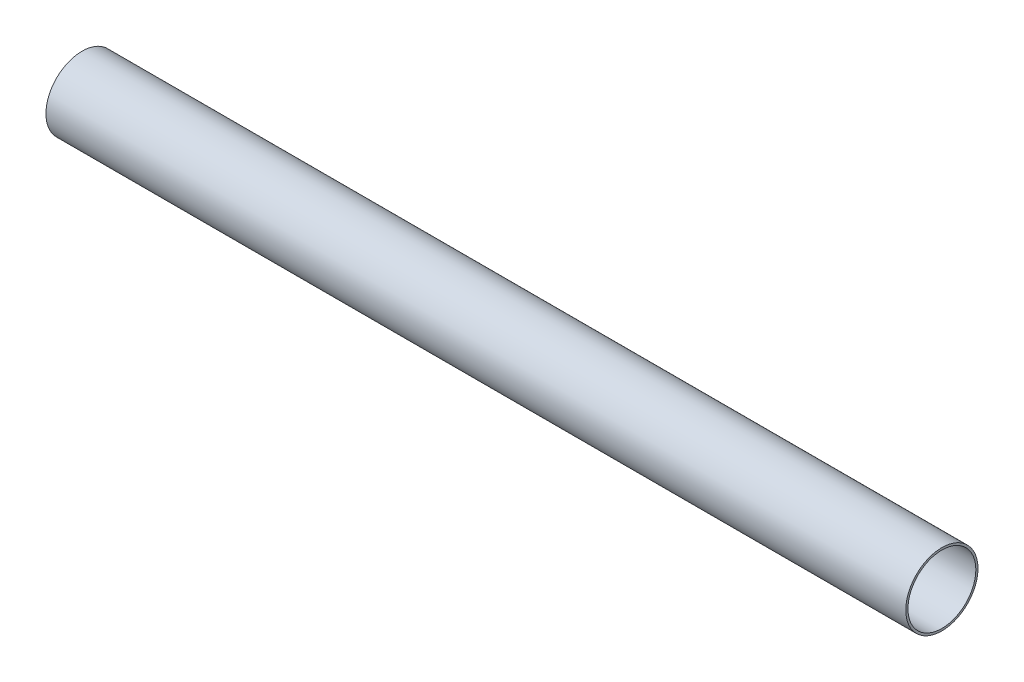
ISO-10303-21;
HEADER;
FILE_DESCRIPTION(('STEP AP214'),'2;1');
FILE_NAME('part.step','',(''),(''),'','','');
FILE_SCHEMA(('AUTOMOTIVE_DESIGN { 1 0 10303 214 1 1 1 1 }'));
ENDSEC;
DATA;
#1=APPLICATION_CONTEXT('core data for automotive mechanical design processes');
#2=APPLICATION_PROTOCOL_DEFINITION('international standard','automotive_design',2000,#1);
#3=PRODUCT_CONTEXT('',#1,'mechanical');
#4=PRODUCT('Part','Part','',(#3));
#5=PRODUCT_RELATED_PRODUCT_CATEGORY('part','',(#4));
#6=PRODUCT_DEFINITION_FORMATION('','',#4);
#7=PRODUCT_DEFINITION_CONTEXT('part definition',#1,'design');
#8=PRODUCT_DEFINITION('design','',#6,#7);
#9=PRODUCT_DEFINITION_SHAPE('','',#8);
#10=(LENGTH_UNIT() NAMED_UNIT(*) SI_UNIT(.MILLI.,.METRE.));
#11=(NAMED_UNIT(*) PLANE_ANGLE_UNIT() SI_UNIT($,.RADIAN.));
#12=(NAMED_UNIT(*) SI_UNIT($,.STERADIAN.) SOLID_ANGLE_UNIT());
#13=UNCERTAINTY_MEASURE_WITH_UNIT(LENGTH_MEASURE(1.E-05),#10,'distance_accuracy_value','');
#14=(GEOMETRIC_REPRESENTATION_CONTEXT(3) GLOBAL_UNCERTAINTY_ASSIGNED_CONTEXT((#13)) GLOBAL_UNIT_ASSIGNED_CONTEXT((#10,
#11,#12)) REPRESENTATION_CONTEXT('',''));
#15=CARTESIAN_POINT('',(0.,0.,0.));
#16=DIRECTION('',(0.,0.,1.));
#17=DIRECTION('',(1.,0.,0.));
#18=AXIS2_PLACEMENT_3D('',#15,#16,#17);
#19=CARTESIAN_POINT('',(2000.,0.,0.));
#20=DIRECTION('',(1.,0.,0.));
#21=DIRECTION('',(0.,0.,-1.));
#22=AXIS2_PLACEMENT_3D('',#19,#20,#21);
#23=PLANE('',#22);
#24=CARTESIAN_POINT('',(2000.,0.,0.));
#25=DIRECTION('',(1.,0.,0.));
#26=DIRECTION('',(0.,0.,-1.));
#27=AXIS2_PLACEMENT_3D('',#24,#25,#26);
#28=CIRCLE('',#27,84.);
#29=CARTESIAN_POINT('',(2000.,0.,-84.));
#30=VERTEX_POINT('',#29);
#31=EDGE_CURVE('E10',#30,#30,#28,.T.);
#32=ORIENTED_EDGE('',*,*,#31,.T.);
#33=EDGE_LOOP('',(#32));
#34=FACE_BOUND('',#33,.T.);
#35=CARTESIAN_POINT('',(2000.,0.,0.));
#36=DIRECTION('',(1.,0.,0.));
#37=DIRECTION('',(0.,0.,-1.));
#38=AXIS2_PLACEMENT_3D('',#35,#36,#37);
#39=CIRCLE('',#38,79.);
#40=CARTESIAN_POINT('',(2000.,0.,-79.));
#41=VERTEX_POINT('',#40);
#42=EDGE_CURVE('E50',#41,#41,#39,.T.);
#43=ORIENTED_EDGE('',*,*,#42,.F.);
#44=EDGE_LOOP('',(#43));
#45=FACE_BOUND('',#44,.T.);
#46=ADVANCED_FACE('F37',(#34,#45),#23,.T.);
#47=CARTESIAN_POINT('',(0.,0.,0.));
#48=DIRECTION('',(1.,0.,0.));
#49=DIRECTION('',(0.,0.,-1.));
#50=AXIS2_PLACEMENT_3D('',#47,#48,#49);
#51=PLANE('',#50);
#52=CARTESIAN_POINT('',(0.,0.,0.));
#53=DIRECTION('',(1.,0.,0.));
#54=DIRECTION('',(0.,0.,-1.));
#55=AXIS2_PLACEMENT_3D('',#52,#53,#54);
#56=CIRCLE('',#55,84.);
#57=CARTESIAN_POINT('',(0.,0.,-84.));
#58=VERTEX_POINT('',#57);
#59=EDGE_CURVE('E41',#58,#58,#56,.T.);
#60=ORIENTED_EDGE('',*,*,#59,.F.);
#61=EDGE_LOOP('',(#60));
#62=FACE_BOUND('',#61,.T.);
#63=CARTESIAN_POINT('',(0.,0.,0.));
#64=DIRECTION('',(1.,0.,0.));
#65=DIRECTION('',(0.,0.,-1.));
#66=AXIS2_PLACEMENT_3D('',#63,#64,#65);
#67=CIRCLE('',#66,79.);
#68=CARTESIAN_POINT('',(0.,0.,-79.));
#69=VERTEX_POINT('',#68);
#70=EDGE_CURVE('E52',#69,#69,#67,.T.);
#71=ORIENTED_EDGE('',*,*,#70,.T.);
#72=EDGE_LOOP('',(#71));
#73=FACE_BOUND('',#72,.T.);
#74=ADVANCED_FACE('F64',(#62,#73),#51,.F.);
#75=CARTESIAN_POINT('',(2000.,0.,0.));
#76=DIRECTION('',(-1.,0.,0.));
#77=DIRECTION('',(0.,0.,1.));
#78=AXIS2_PLACEMENT_3D('',#75,#76,#77);
#79=CYLINDRICAL_SURFACE('',#78,84.);
#80=ORIENTED_EDGE('',*,*,#31,.F.);
#81=EDGE_LOOP('',(#80));
#82=FACE_BOUND('',#81,.T.);
#83=ORIENTED_EDGE('',*,*,#59,.T.);
#84=EDGE_LOOP('',(#83));
#85=FACE_BOUND('',#84,.T.);
#86=ADVANCED_FACE('F39',(#82,#85),#79,.T.);
#87=CARTESIAN_POINT('',(2000.,0.,0.));
#88=DIRECTION('',(-1.,0.,0.));
#89=DIRECTION('',(0.,0.,1.));
#90=AXIS2_PLACEMENT_3D('',#87,#88,#89);
#91=CYLINDRICAL_SURFACE('',#90,79.);
#92=ORIENTED_EDGE('',*,*,#42,.T.);
#93=EDGE_LOOP('',(#92));
#94=FACE_BOUND('',#93,.T.);
#95=ORIENTED_EDGE('',*,*,#70,.F.);
#96=EDGE_LOOP('',(#95));
#97=FACE_BOUND('',#96,.T.);
#98=ADVANCED_FACE('F60',(#94,#97),#91,.F.);
#99=CLOSED_SHELL('',(#46,#74,#86,#98));
#100=MANIFOLD_SOLID_BREP('B2',#99);
#101=ADVANCED_BREP_SHAPE_REPRESENTATION('',(#18,#100),#14);
#102=SHAPE_DEFINITION_REPRESENTATION(#9,#101);
ENDSEC;
END-ISO-10303-21;
